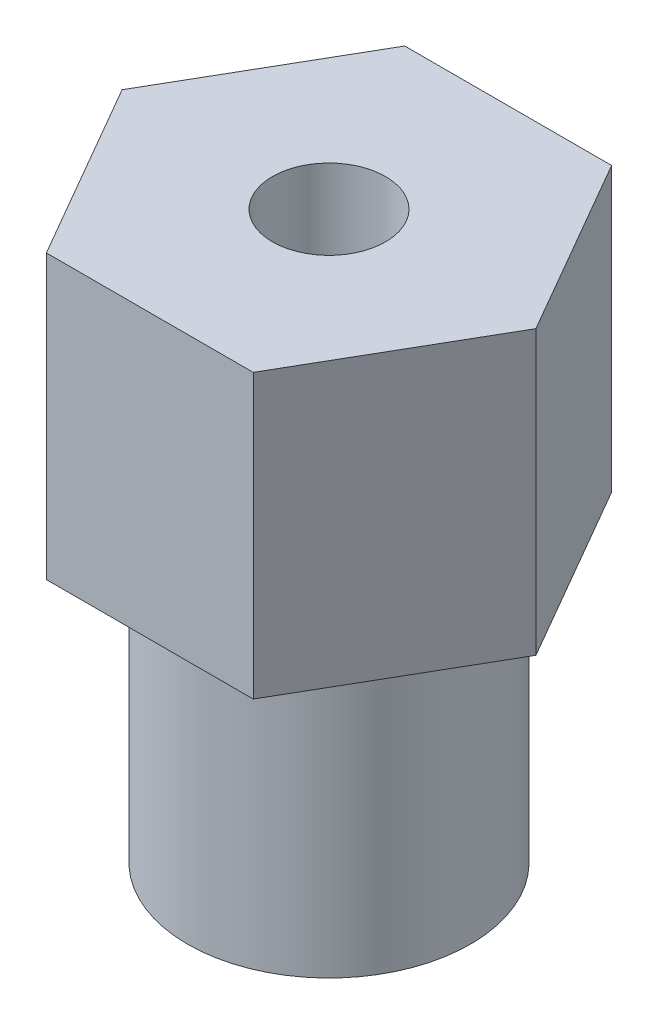
ISO-10303-21;
HEADER;
FILE_DESCRIPTION(('STEP AP214'),'2;1');
FILE_NAME('part.step','',(''),(''),'','','');
FILE_SCHEMA(('AUTOMOTIVE_DESIGN { 1 0 10303 214 1 1 1 1 }'));
ENDSEC;
DATA;
#1=APPLICATION_CONTEXT('core data for automotive mechanical design processes');
#2=APPLICATION_PROTOCOL_DEFINITION('international standard','automotive_design',2000,#1);
#3=PRODUCT_CONTEXT('',#1,'mechanical');
#4=PRODUCT('Part','Part','',(#3));
#5=PRODUCT_RELATED_PRODUCT_CATEGORY('part','',(#4));
#6=PRODUCT_DEFINITION_FORMATION('','',#4);
#7=PRODUCT_DEFINITION_CONTEXT('part definition',#1,'design');
#8=PRODUCT_DEFINITION('design','',#6,#7);
#9=PRODUCT_DEFINITION_SHAPE('','',#8);
#10=(LENGTH_UNIT() NAMED_UNIT(*) SI_UNIT(.MILLI.,.METRE.));
#11=(NAMED_UNIT(*) PLANE_ANGLE_UNIT() SI_UNIT($,.RADIAN.));
#12=(NAMED_UNIT(*) SI_UNIT($,.STERADIAN.) SOLID_ANGLE_UNIT());
#13=UNCERTAINTY_MEASURE_WITH_UNIT(LENGTH_MEASURE(1.E-05),#10,'distance_accuracy_value','');
#14=(GEOMETRIC_REPRESENTATION_CONTEXT(3) GLOBAL_UNCERTAINTY_ASSIGNED_CONTEXT((#13)) GLOBAL_UNIT_ASSIGNED_CONTEXT((#10,
#11,#12)) REPRESENTATION_CONTEXT('',''));
#15=CARTESIAN_POINT('',(0.,0.,0.));
#16=DIRECTION('',(0.,0.,1.));
#17=DIRECTION('',(1.,0.,0.));
#18=AXIS2_PLACEMENT_3D('',#15,#16,#17);
#19=CARTESIAN_POINT('',(0.,15.,9.5));
#20=DIRECTION('',(0.,0.,-1.));
#21=DIRECTION('',(-1.,0.,0.));
#22=AXIS2_PLACEMENT_3D('',#19,#20,#21);
#23=PLANE('',#22);
#24=DIRECTION('',(1.,0.,0.));
#25=VECTOR('',#24,1.);
#26=CARTESIAN_POINT('',(0.,0.,9.5));
#27=LINE('',#26,#25);
#28=CARTESIAN_POINT('',(-5.48482755730136,0.,9.50000000000006));
#29=VERTEX_POINT('',#28);
#30=CARTESIAN_POINT('',(5.48482755730156,0.,9.49999999999994));
#31=VERTEX_POINT('',#30);
#32=EDGE_CURVE('E139',#29,#31,#27,.T.);
#33=ORIENTED_EDGE('',*,*,#32,.T.);
#34=DIRECTION('',(0.,-1.,0.));
#35=VECTOR('',#34,1.);
#36=CARTESIAN_POINT('',(5.48482755730156,15.,9.49999999999994));
#37=LINE('',#36,#35);
#38=CARTESIAN_POINT('',(5.48482755730156,15.,9.49999999999994));
#39=VERTEX_POINT('',#38);
#40=EDGE_CURVE('E11',#39,#31,#37,.T.);
#41=ORIENTED_EDGE('',*,*,#40,.F.);
#42=DIRECTION('',(1.,0.,0.));
#43=VECTOR('',#42,1.);
#44=CARTESIAN_POINT('',(0.,15.,9.5));
#45=LINE('',#44,#43);
#46=CARTESIAN_POINT('',(-5.48482755730136,15.,9.50000000000006));
#47=VERTEX_POINT('',#46);
#48=EDGE_CURVE('E156',#47,#39,#45,.T.);
#49=ORIENTED_EDGE('',*,*,#48,.F.);
#50=DIRECTION('',(0.,-1.,0.));
#51=VECTOR('',#50,1.);
#52=CARTESIAN_POINT('',(-5.48482755730136,15.,9.50000000000006));
#53=LINE('',#52,#51);
#54=EDGE_CURVE('E138',#47,#29,#53,.T.);
#55=ORIENTED_EDGE('',*,*,#54,.T.);
#56=EDGE_LOOP('',(#33,#41,#49,#55));
#57=FACE_BOUND('',#56,.T.);
#58=ADVANCED_FACE('F45',(#57),#23,.F.);
#59=CARTESIAN_POINT('',(8.22724133595223,15.,4.74999999999997));
#60=DIRECTION('',(-0.866025403784441,0.,-0.499999999999995));
#61=DIRECTION('',(-0.499999999999995,0.,0.866025403784441));
#62=AXIS2_PLACEMENT_3D('',#59,#60,#61);
#63=PLANE('',#62);
#64=DIRECTION('',(0.499999999999995,0.,-0.866025403784441));
#65=VECTOR('',#64,1.);
#66=CARTESIAN_POINT('',(8.22724133595223,0.,4.74999999999997));
#67=LINE('',#66,#65);
#68=CARTESIAN_POINT('',(10.9696551146029,0.,0.));
#69=VERTEX_POINT('',#68);
#70=EDGE_CURVE('E143',#31,#69,#67,.T.);
#71=ORIENTED_EDGE('',*,*,#70,.T.);
#72=DIRECTION('',(0.,-1.,0.));
#73=VECTOR('',#72,1.);
#74=CARTESIAN_POINT('',(10.9696551146029,15.,0.));
#75=LINE('',#74,#73);
#76=CARTESIAN_POINT('',(10.9696551146029,15.,0.));
#77=VERTEX_POINT('',#76);
#78=EDGE_CURVE('E54',#77,#69,#75,.T.);
#79=ORIENTED_EDGE('',*,*,#78,.F.);
#80=DIRECTION('',(0.499999999999995,0.,-0.866025403784441));
#81=VECTOR('',#80,1.);
#82=CARTESIAN_POINT('',(8.22724133595223,15.,4.74999999999997));
#83=LINE('',#82,#81);
#84=EDGE_CURVE('E99',#39,#77,#83,.T.);
#85=ORIENTED_EDGE('',*,*,#84,.F.);
#86=ORIENTED_EDGE('',*,*,#40,.T.);
#87=EDGE_LOOP('',(#71,#79,#85,#86));
#88=FACE_BOUND('',#87,.T.);
#89=ADVANCED_FACE('F185',(#88),#63,.F.);
#90=CARTESIAN_POINT('',(8.22724133595216,15.,-4.75000000000001));
#91=DIRECTION('',(-0.866025403784438,0.,0.500000000000001));
#92=DIRECTION('',(0.500000000000001,0.,0.866025403784438));
#93=AXIS2_PLACEMENT_3D('',#90,#91,#92);
#94=PLANE('',#93);
#95=DIRECTION('',(-0.500000000000001,0.,-0.866025403784438));
#96=VECTOR('',#95,1.);
#97=CARTESIAN_POINT('',(8.22724133595216,0.,-4.75000000000001));
#98=LINE('',#97,#96);
#99=CARTESIAN_POINT('',(5.48482755730143,0.,-9.50000000000002));
#100=VERTEX_POINT('',#99);
#101=EDGE_CURVE('E147',#69,#100,#98,.T.);
#102=ORIENTED_EDGE('',*,*,#101,.T.);
#103=DIRECTION('',(0.,-1.,0.));
#104=VECTOR('',#103,1.);
#105=CARTESIAN_POINT('',(5.48482755730143,15.,-9.50000000000002));
#106=LINE('',#105,#104);
#107=CARTESIAN_POINT('',(5.48482755730143,15.,-9.50000000000002));
#108=VERTEX_POINT('',#107);
#109=EDGE_CURVE('E124',#108,#100,#106,.T.);
#110=ORIENTED_EDGE('',*,*,#109,.F.);
#111=DIRECTION('',(-0.500000000000001,0.,-0.866025403784438));
#112=VECTOR('',#111,1.);
#113=CARTESIAN_POINT('',(8.22724133595216,15.,-4.75000000000001));
#114=LINE('',#113,#112);
#115=EDGE_CURVE('E113',#77,#108,#114,.T.);
#116=ORIENTED_EDGE('',*,*,#115,.F.);
#117=ORIENTED_EDGE('',*,*,#78,.T.);
#118=EDGE_LOOP('',(#102,#110,#116,#117));
#119=FACE_BOUND('',#118,.T.);
#120=ADVANCED_FACE('F166',(#119),#94,.F.);
#121=CARTESIAN_POINT('',(0.,15.,-9.5));
#122=DIRECTION('',(0.,0.,1.));
#123=DIRECTION('',(1.,0.,0.));
#124=AXIS2_PLACEMENT_3D('',#121,#122,#123);
#125=PLANE('',#124);
#126=DIRECTION('',(-1.,0.,0.));
#127=VECTOR('',#126,1.);
#128=CARTESIAN_POINT('',(0.,0.,-9.5));
#129=LINE('',#128,#127);
#130=CARTESIAN_POINT('',(-5.48482755730149,0.,-9.49999999999998));
#131=VERTEX_POINT('',#130);
#132=EDGE_CURVE('E122',#100,#131,#129,.T.);
#133=ORIENTED_EDGE('',*,*,#132,.T.);
#134=DIRECTION('',(0.,-1.,0.));
#135=VECTOR('',#134,1.);
#136=CARTESIAN_POINT('',(-5.48482755730149,15.,-9.49999999999998));
#137=LINE('',#136,#135);
#138=CARTESIAN_POINT('',(-5.48482755730149,15.,-9.49999999999998));
#139=VERTEX_POINT('',#138);
#140=EDGE_CURVE('E119',#139,#131,#137,.T.);
#141=ORIENTED_EDGE('',*,*,#140,.F.);
#142=DIRECTION('',(-1.,0.,0.));
#143=VECTOR('',#142,1.);
#144=CARTESIAN_POINT('',(0.,15.,-9.5));
#145=LINE('',#144,#143);
#146=EDGE_CURVE('E106',#108,#139,#145,.T.);
#147=ORIENTED_EDGE('',*,*,#146,.F.);
#148=ORIENTED_EDGE('',*,*,#109,.T.);
#149=EDGE_LOOP('',(#133,#141,#147,#148));
#150=FACE_BOUND('',#149,.T.);
#151=ADVANCED_FACE('F120',(#150),#125,.F.);
#152=CARTESIAN_POINT('',(-8.2272413359522,15.,-4.74999999999995));
#153=DIRECTION('',(0.866025403784442,0.,0.499999999999995));
#154=DIRECTION('',(0.499999999999995,0.,-0.866025403784442));
#155=AXIS2_PLACEMENT_3D('',#152,#153,#154);
#156=PLANE('',#155);
#157=DIRECTION('',(-0.499999999999995,0.,0.866025403784442));
#158=VECTOR('',#157,1.);
#159=CARTESIAN_POINT('',(-8.2272413359522,0.,-4.74999999999995));
#160=LINE('',#159,#158);
#161=CARTESIAN_POINT('',(-10.9696551146029,0.,0.));
#162=VERTEX_POINT('',#161);
#163=EDGE_CURVE('E85',#131,#162,#160,.T.);
#164=ORIENTED_EDGE('',*,*,#163,.T.);
#165=DIRECTION('',(0.,-1.,0.));
#166=VECTOR('',#165,1.);
#167=CARTESIAN_POINT('',(-10.9696551146029,15.,0.));
#168=LINE('',#167,#166);
#169=CARTESIAN_POINT('',(-10.9696551146029,15.,0.));
#170=VERTEX_POINT('',#169);
#171=EDGE_CURVE('E125',#170,#162,#168,.T.);
#172=ORIENTED_EDGE('',*,*,#171,.F.);
#173=DIRECTION('',(-0.499999999999995,0.,0.866025403784442));
#174=VECTOR('',#173,1.);
#175=CARTESIAN_POINT('',(-8.2272413359522,15.,-4.74999999999995));
#176=LINE('',#175,#174);
#177=EDGE_CURVE('E111',#139,#170,#176,.T.);
#178=ORIENTED_EDGE('',*,*,#177,.F.);
#179=ORIENTED_EDGE('',*,*,#140,.T.);
#180=EDGE_LOOP('',(#164,#172,#178,#179));
#181=FACE_BOUND('',#180,.T.);
#182=ADVANCED_FACE('F127',(#181),#156,.F.);
#183=CARTESIAN_POINT('',(-8.22724133595213,15.,4.75000000000007));
#184=DIRECTION('',(0.866025403784434,0.,-0.500000000000007));
#185=DIRECTION('',(-0.500000000000007,0.,-0.866025403784435));
#186=AXIS2_PLACEMENT_3D('',#183,#184,#185);
#187=PLANE('',#186);
#188=DIRECTION('',(0.500000000000007,0.,0.866025403784435));
#189=VECTOR('',#188,1.);
#190=CARTESIAN_POINT('',(-8.22724133595213,0.,4.75000000000007));
#191=LINE('',#190,#189);
#192=EDGE_CURVE('E91',#162,#29,#191,.T.);
#193=ORIENTED_EDGE('',*,*,#192,.T.);
#194=ORIENTED_EDGE('',*,*,#54,.F.);
#195=DIRECTION('',(0.500000000000007,0.,0.866025403784435));
#196=VECTOR('',#195,1.);
#197=CARTESIAN_POINT('',(-8.22724133595213,15.,4.75000000000007));
#198=LINE('',#197,#196);
#199=EDGE_CURVE('E62',#170,#47,#198,.T.);
#200=ORIENTED_EDGE('',*,*,#199,.F.);
#201=ORIENTED_EDGE('',*,*,#171,.T.);
#202=EDGE_LOOP('',(#193,#194,#200,#201));
#203=FACE_BOUND('',#202,.T.);
#204=ADVANCED_FACE('F173',(#203),#187,.F.);
#205=CARTESIAN_POINT('',(0.,15.,0.));
#206=DIRECTION('',(0.,-1.,0.));
#207=DIRECTION('',(0.,0.,-1.));
#208=AXIS2_PLACEMENT_3D('',#205,#206,#207);
#209=CYLINDRICAL_SURFACE('',#208,3.);
#210=CARTESIAN_POINT('',(0.,15.,0.));
#211=DIRECTION('',(0.,1.,0.));
#212=DIRECTION('',(0.,0.,1.));
#213=AXIS2_PLACEMENT_3D('',#210,#211,#212);
#214=CIRCLE('',#213,3.);
#215=CARTESIAN_POINT('',(0.,15.,3.));
#216=VERTEX_POINT('',#215);
#217=EDGE_CURVE('E131',#216,#216,#214,.T.);
#218=ORIENTED_EDGE('',*,*,#217,.T.);
#219=EDGE_LOOP('',(#218));
#220=FACE_BOUND('',#219,.T.);
#221=CARTESIAN_POINT('',(0.,-15.,0.));
#222=DIRECTION('',(0.,1.,0.));
#223=DIRECTION('',(0.,0.,1.));
#224=AXIS2_PLACEMENT_3D('',#221,#222,#223);
#225=CIRCLE('',#224,3.);
#226=CARTESIAN_POINT('',(0.,-15.,3.));
#227=VERTEX_POINT('',#226);
#228=EDGE_CURVE('E302',#227,#227,#225,.T.);
#229=ORIENTED_EDGE('',*,*,#228,.F.);
#230=EDGE_LOOP('',(#229));
#231=FACE_BOUND('',#230,.T.);
#232=ADVANCED_FACE('F175',(#220,#231),#209,.F.);
#233=CARTESIAN_POINT('',(0.,15.,0.));
#234=DIRECTION('',(0.,1.,0.));
#235=DIRECTION('',(0.,0.,1.));
#236=AXIS2_PLACEMENT_3D('',#233,#234,#235);
#237=PLANE('',#236);
#238=ORIENTED_EDGE('',*,*,#48,.T.);
#239=ORIENTED_EDGE('',*,*,#84,.T.);
#240=ORIENTED_EDGE('',*,*,#115,.T.);
#241=ORIENTED_EDGE('',*,*,#146,.T.);
#242=ORIENTED_EDGE('',*,*,#177,.T.);
#243=ORIENTED_EDGE('',*,*,#199,.T.);
#244=EDGE_LOOP('',(#238,#239,#240,#241,#242,#243));
#245=FACE_BOUND('',#244,.T.);
#246=ORIENTED_EDGE('',*,*,#217,.F.);
#247=EDGE_LOOP('',(#246));
#248=FACE_BOUND('',#247,.T.);
#249=ADVANCED_FACE('F108',(#245,#248),#237,.T.);
#250=CARTESIAN_POINT('',(0.,0.,0.));
#251=DIRECTION('',(0.,1.,0.));
#252=DIRECTION('',(0.,0.,1.));
#253=AXIS2_PLACEMENT_3D('',#250,#251,#252);
#254=PLANE('',#253);
#255=CARTESIAN_POINT('',(0.,0.,0.));
#256=DIRECTION('',(0.,1.,0.));
#257=DIRECTION('',(0.,0.,1.));
#258=AXIS2_PLACEMENT_3D('',#255,#256,#257);
#259=CIRCLE('',#258,7.5);
#260=CARTESIAN_POINT('',(0.,0.,7.5));
#261=VERTEX_POINT('',#260);
#262=EDGE_CURVE('E308',#261,#261,#259,.T.);
#263=ORIENTED_EDGE('',*,*,#262,.T.);
#264=EDGE_LOOP('',(#263));
#265=FACE_BOUND('',#264,.T.);
#266=ORIENTED_EDGE('',*,*,#32,.F.);
#267=ORIENTED_EDGE('',*,*,#192,.F.);
#268=ORIENTED_EDGE('',*,*,#163,.F.);
#269=ORIENTED_EDGE('',*,*,#132,.F.);
#270=ORIENTED_EDGE('',*,*,#101,.F.);
#271=ORIENTED_EDGE('',*,*,#70,.F.);
#272=EDGE_LOOP('',(#266,#267,#268,#269,#270,#271));
#273=FACE_BOUND('',#272,.T.);
#274=ADVANCED_FACE('F169',(#265,#273),#254,.F.);
#275=CARTESIAN_POINT('',(0.,-15.,0.));
#276=DIRECTION('',(0.,1.,0.));
#277=DIRECTION('',(0.,0.,1.));
#278=AXIS2_PLACEMENT_3D('',#275,#276,#277);
#279=CYLINDRICAL_SURFACE('',#278,7.5);
#280=CARTESIAN_POINT('',(0.,-15.,0.));
#281=DIRECTION('',(0.,1.,0.));
#282=DIRECTION('',(0.,0.,1.));
#283=AXIS2_PLACEMENT_3D('',#280,#281,#282);
#284=CIRCLE('',#283,7.5);
#285=CARTESIAN_POINT('',(0.,-15.,7.5));
#286=VERTEX_POINT('',#285);
#287=EDGE_CURVE('E144',#286,#286,#284,.T.);
#288=ORIENTED_EDGE('',*,*,#287,.T.);
#289=EDGE_LOOP('',(#288));
#290=FACE_BOUND('',#289,.T.);
#291=ORIENTED_EDGE('',*,*,#262,.F.);
#292=EDGE_LOOP('',(#291));
#293=FACE_BOUND('',#292,.T.);
#294=ADVANCED_FACE('F236',(#290,#293),#279,.T.);
#295=CARTESIAN_POINT('',(0.,-15.,0.));
#296=DIRECTION('',(0.,1.,0.));
#297=DIRECTION('',(0.,0.,1.));
#298=AXIS2_PLACEMENT_3D('',#295,#296,#297);
#299=PLANE('',#298);
#300=ORIENTED_EDGE('',*,*,#228,.T.);
#301=EDGE_LOOP('',(#300));
#302=FACE_BOUND('',#301,.T.);
#303=ORIENTED_EDGE('',*,*,#287,.F.);
#304=EDGE_LOOP('',(#303));
#305=FACE_BOUND('',#304,.T.);
#306=ADVANCED_FACE('F245',(#302,#305),#299,.F.);
#307=CLOSED_SHELL('',(#58,#89,#120,#151,#182,#204,#232,#249,#274,#294,#306));
#308=MANIFOLD_SOLID_BREP('B2',#307);
#309=ADVANCED_BREP_SHAPE_REPRESENTATION('',(#18,#308),#14);
#310=SHAPE_DEFINITION_REPRESENTATION(#9,#309);
ENDSEC;
END-ISO-10303-21;
